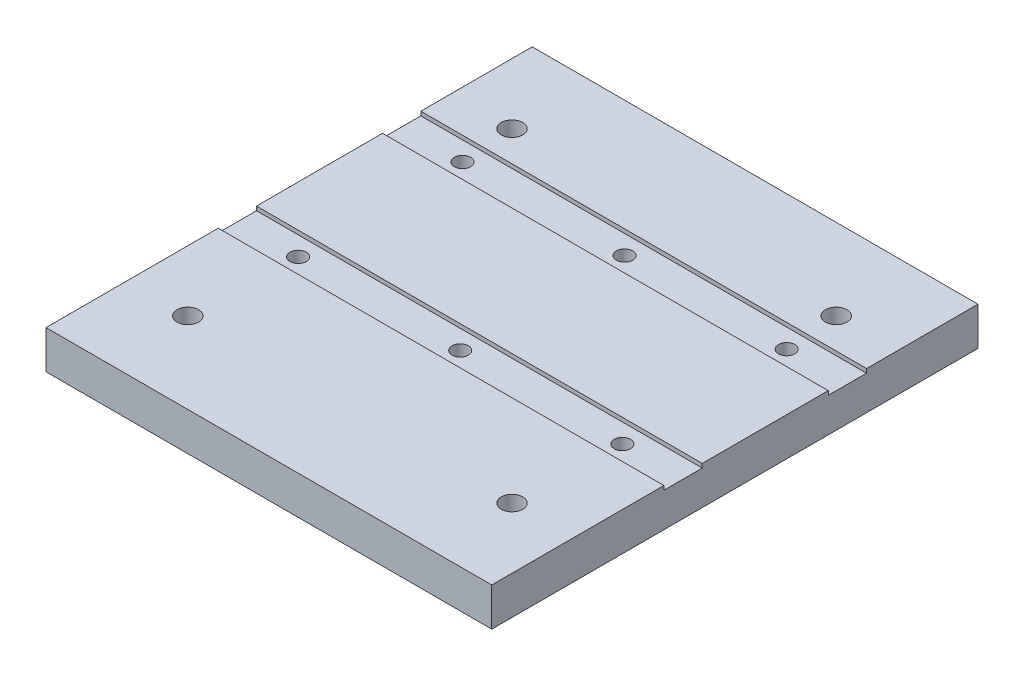
ISO-10303-21;
HEADER;
FILE_DESCRIPTION(('STEP AP214'),'2;1');
FILE_NAME('part.step','',(''),(''),'','','');
FILE_SCHEMA(('AUTOMOTIVE_DESIGN { 1 0 10303 214 1 1 1 1 }'));
ENDSEC;
DATA;
#1=APPLICATION_CONTEXT('core data for automotive mechanical design processes');
#2=APPLICATION_PROTOCOL_DEFINITION('international standard','automotive_design',2000,#1);
#3=PRODUCT_CONTEXT('',#1,'mechanical');
#4=PRODUCT('Part','Part','',(#3));
#5=PRODUCT_RELATED_PRODUCT_CATEGORY('part','',(#4));
#6=PRODUCT_DEFINITION_FORMATION('','',#4);
#7=PRODUCT_DEFINITION_CONTEXT('part definition',#1,'design');
#8=PRODUCT_DEFINITION('design','',#6,#7);
#9=PRODUCT_DEFINITION_SHAPE('','',#8);
#10=(LENGTH_UNIT() NAMED_UNIT(*) SI_UNIT(.MILLI.,.METRE.));
#11=(NAMED_UNIT(*) PLANE_ANGLE_UNIT() SI_UNIT($,.RADIAN.));
#12=(NAMED_UNIT(*) SI_UNIT($,.STERADIAN.) SOLID_ANGLE_UNIT());
#13=UNCERTAINTY_MEASURE_WITH_UNIT(LENGTH_MEASURE(1.E-05),#10,'distance_accuracy_value','');
#14=(GEOMETRIC_REPRESENTATION_CONTEXT(3) GLOBAL_UNCERTAINTY_ASSIGNED_CONTEXT((#13)) GLOBAL_UNIT_ASSIGNED_CONTEXT((#10,
#11,#12)) REPRESENTATION_CONTEXT('',''));
#15=CARTESIAN_POINT('',(0.,0.,0.));
#16=DIRECTION('',(0.,0.,1.));
#17=DIRECTION('',(1.,0.,0.));
#18=AXIS2_PLACEMENT_3D('',#15,#16,#17);
#19=CARTESIAN_POINT('',(0.,12.,0.));
#20=DIRECTION('',(0.,-1.,0.));
#21=DIRECTION('',(0.,0.,-1.));
#22=AXIS2_PLACEMENT_3D('',#19,#20,#21);
#23=PLANE('',#22);
#24=CARTESIAN_POINT('',(-50.8,12.,-50.8));
#25=DIRECTION('',(0.,1.,0.));
#26=DIRECTION('',(0.,0.,1.));
#27=AXIS2_PLACEMENT_3D('',#24,#25,#26);
#28=CIRCLE('',#27,3.3782);
#29=CARTESIAN_POINT('',(-50.8,12.,-47.4218));
#30=VERTEX_POINT('',#29);
#31=EDGE_CURVE('E185',#30,#30,#28,.T.);
#32=ORIENTED_EDGE('',*,*,#31,.F.);
#33=EDGE_LOOP('',(#32));
#34=FACE_BOUND('',#33,.T.);
#35=CARTESIAN_POINT('',(50.8,12.,-50.8));
#36=DIRECTION('',(0.,1.,0.));
#37=DIRECTION('',(0.,0.,1.));
#38=AXIS2_PLACEMENT_3D('',#35,#36,#37);
#39=CIRCLE('',#38,3.3782);
#40=CARTESIAN_POINT('',(50.8,12.,-47.4218));
#41=VERTEX_POINT('',#40);
#42=EDGE_CURVE('E192',#41,#41,#39,.T.);
#43=ORIENTED_EDGE('',*,*,#42,.F.);
#44=EDGE_LOOP('',(#43));
#45=FACE_BOUND('',#44,.T.);
#46=DIRECTION('',(0.,0.,1.));
#47=VECTOR('',#46,1.);
#48=CARTESIAN_POINT('',(-69.85,12.,76.2));
#49=LINE('',#48,#47);
#50=CARTESIAN_POINT('',(-69.85,12.,-76.2));
#51=VERTEX_POINT('',#50);
#52=CARTESIAN_POINT('',(-69.85,12.,-41.275));
#53=VERTEX_POINT('',#52);
#54=EDGE_CURVE('E219',#51,#53,#49,.T.);
#55=ORIENTED_EDGE('',*,*,#54,.T.);
#56=DIRECTION('',(-1.,0.,0.));
#57=VECTOR('',#56,1.);
#58=CARTESIAN_POINT('',(-69.85,12.,-41.275));
#59=LINE('',#58,#57);
#60=CARTESIAN_POINT('',(69.85,12.,-41.275));
#61=VERTEX_POINT('',#60);
#62=EDGE_CURVE('E147',#61,#53,#59,.T.);
#63=ORIENTED_EDGE('',*,*,#62,.F.);
#64=DIRECTION('',(0.,0.,-1.));
#65=VECTOR('',#64,1.);
#66=CARTESIAN_POINT('',(69.85,12.,76.2));
#67=LINE('',#66,#65);
#68=CARTESIAN_POINT('',(69.85,12.,-76.2));
#69=VERTEX_POINT('',#68);
#70=EDGE_CURVE('E216',#61,#69,#67,.T.);
#71=ORIENTED_EDGE('',*,*,#70,.T.);
#72=DIRECTION('',(-1.,0.,0.));
#73=VECTOR('',#72,1.);
#74=CARTESIAN_POINT('',(-69.85,12.,-76.2));
#75=LINE('',#74,#73);
#76=EDGE_CURVE('E214',#69,#51,#75,.T.);
#77=ORIENTED_EDGE('',*,*,#76,.T.);
#78=EDGE_LOOP('',(#55,#63,#71,#77));
#79=FACE_BOUND('',#78,.T.);
#80=ADVANCED_FACE('F41',(#34,#45,#79),#23,.F.);
#81=CARTESIAN_POINT('',(69.85,12.,10.225));
#82=VERTEX_POINT('',#81);
#83=CARTESIAN_POINT('',(69.85,12.,-29.275));
#84=VERTEX_POINT('',#83);
#85=EDGE_CURVE('E215',#82,#84,#67,.T.);
#86=ORIENTED_EDGE('',*,*,#85,.T.);
#87=DIRECTION('',(1.,0.,0.));
#88=VECTOR('',#87,1.);
#89=CARTESIAN_POINT('',(-69.85,12.,-29.275));
#90=LINE('',#89,#88);
#91=CARTESIAN_POINT('',(-69.85,12.,-29.275));
#92=VERTEX_POINT('',#91);
#93=EDGE_CURVE('E175',#92,#84,#90,.T.);
#94=ORIENTED_EDGE('',*,*,#93,.F.);
#95=CARTESIAN_POINT('',(-69.85,12.,10.225));
#96=VERTEX_POINT('',#95);
#97=EDGE_CURVE('E153',#92,#96,#49,.T.);
#98=ORIENTED_EDGE('',*,*,#97,.T.);
#99=DIRECTION('',(-1.,0.,0.));
#100=VECTOR('',#99,1.);
#101=CARTESIAN_POINT('',(-69.85,12.,10.225));
#102=LINE('',#101,#100);
#103=EDGE_CURVE('E170',#82,#96,#102,.T.);
#104=ORIENTED_EDGE('',*,*,#103,.F.);
#105=EDGE_LOOP('',(#86,#94,#98,#104));
#106=FACE_BOUND('',#105,.T.);
#107=ADVANCED_FACE('F318',(#106),#23,.F.);
#108=CARTESIAN_POINT('',(69.85,12.,76.2));
#109=DIRECTION('',(-1.,0.,0.));
#110=DIRECTION('',(0.,0.,1.));
#111=AXIS2_PLACEMENT_3D('',#108,#109,#110);
#112=PLANE('',#111);
#113=ORIENTED_EDGE('',*,*,#70,.F.);
#114=DIRECTION('',(0.,1.,0.));
#115=VECTOR('',#114,1.);
#116=CARTESIAN_POINT('',(69.85,10.73,-41.275));
#117=LINE('',#116,#115);
#118=CARTESIAN_POINT('',(69.85,10.73,-41.275));
#119=VERTEX_POINT('',#118);
#120=EDGE_CURVE('E155',#119,#61,#117,.T.);
#121=ORIENTED_EDGE('',*,*,#120,.F.);
#122=DIRECTION('',(0.,0.,-1.));
#123=VECTOR('',#122,1.);
#124=CARTESIAN_POINT('',(69.85,10.73,-41.275));
#125=LINE('',#124,#123);
#126=CARTESIAN_POINT('',(69.85,10.73,-29.275));
#127=VERTEX_POINT('',#126);
#128=EDGE_CURVE('E137',#127,#119,#125,.T.);
#129=ORIENTED_EDGE('',*,*,#128,.F.);
#130=DIRECTION('',(0.,1.,0.));
#131=VECTOR('',#130,1.);
#132=CARTESIAN_POINT('',(69.85,10.73,-29.275));
#133=LINE('',#132,#131);
#134=EDGE_CURVE('E134',#127,#84,#133,.T.);
#135=ORIENTED_EDGE('',*,*,#134,.T.);
#136=ORIENTED_EDGE('',*,*,#85,.F.);
#137=DIRECTION('',(0.,1.,0.));
#138=VECTOR('',#137,1.);
#139=CARTESIAN_POINT('',(69.85,10.73,10.225));
#140=LINE('',#139,#138);
#141=CARTESIAN_POINT('',(69.85,10.73,10.225));
#142=VERTEX_POINT('',#141);
#143=EDGE_CURVE('E165',#142,#82,#140,.T.);
#144=ORIENTED_EDGE('',*,*,#143,.F.);
#145=DIRECTION('',(0.,0.,-1.));
#146=VECTOR('',#145,1.);
#147=CARTESIAN_POINT('',(69.85,10.73,10.225));
#148=LINE('',#147,#146);
#149=CARTESIAN_POINT('',(69.85,10.73,22.225));
#150=VERTEX_POINT('',#149);
#151=EDGE_CURVE('E178',#150,#142,#148,.T.);
#152=ORIENTED_EDGE('',*,*,#151,.F.);
#153=DIRECTION('',(0.,1.,0.));
#154=VECTOR('',#153,1.);
#155=CARTESIAN_POINT('',(69.85,10.73,22.225));
#156=LINE('',#155,#154);
#157=CARTESIAN_POINT('',(69.85,12.,22.225));
#158=VERTEX_POINT('',#157);
#159=EDGE_CURVE('E162',#150,#158,#156,.T.);
#160=ORIENTED_EDGE('',*,*,#159,.T.);
#161=CARTESIAN_POINT('',(69.85,12.,76.2));
#162=VERTEX_POINT('',#161);
#163=EDGE_CURVE('E211',#162,#158,#67,.T.);
#164=ORIENTED_EDGE('',*,*,#163,.F.);
#165=DIRECTION('',(0.,-1.,0.));
#166=VECTOR('',#165,1.);
#167=CARTESIAN_POINT('',(69.85,12.,76.2));
#168=LINE('',#167,#166);
#169=CARTESIAN_POINT('',(69.85,0.,76.2));
#170=VERTEX_POINT('',#169);
#171=EDGE_CURVE('E224',#162,#170,#168,.T.);
#172=ORIENTED_EDGE('',*,*,#171,.T.);
#173=DIRECTION('',(0.,0.,-1.));
#174=VECTOR('',#173,1.);
#175=CARTESIAN_POINT('',(69.85,0.,76.2));
#176=LINE('',#175,#174);
#177=CARTESIAN_POINT('',(69.85,0.,-76.2));
#178=VERTEX_POINT('',#177);
#179=EDGE_CURVE('E210',#170,#178,#176,.T.);
#180=ORIENTED_EDGE('',*,*,#179,.T.);
#181=DIRECTION('',(0.,-1.,0.));
#182=VECTOR('',#181,1.);
#183=CARTESIAN_POINT('',(69.85,12.,-76.2));
#184=LINE('',#183,#182);
#185=EDGE_CURVE('E11',#69,#178,#184,.T.);
#186=ORIENTED_EDGE('',*,*,#185,.F.);
#187=EDGE_LOOP('',(#113,#121,#129,#135,#136,#144,#152,#160,#164,#172,#180,#186));
#188=FACE_BOUND('',#187,.T.);
#189=ADVANCED_FACE('F43',(#188),#112,.F.);
#190=CARTESIAN_POINT('',(-69.85,12.,-76.2));
#191=DIRECTION('',(0.,0.,1.));
#192=DIRECTION('',(1.,0.,0.));
#193=AXIS2_PLACEMENT_3D('',#190,#191,#192);
#194=PLANE('',#193);
#195=DIRECTION('',(-1.,0.,0.));
#196=VECTOR('',#195,1.);
#197=CARTESIAN_POINT('',(-69.85,0.,-76.2));
#198=LINE('',#197,#196);
#199=CARTESIAN_POINT('',(-69.85,0.,-76.2));
#200=VERTEX_POINT('',#199);
#201=EDGE_CURVE('E227',#178,#200,#198,.T.);
#202=ORIENTED_EDGE('',*,*,#201,.T.);
#203=DIRECTION('',(0.,-1.,0.));
#204=VECTOR('',#203,1.);
#205=CARTESIAN_POINT('',(-69.85,12.,-76.2));
#206=LINE('',#205,#204);
#207=EDGE_CURVE('E50',#51,#200,#206,.T.);
#208=ORIENTED_EDGE('',*,*,#207,.F.);
#209=ORIENTED_EDGE('',*,*,#76,.F.);
#210=ORIENTED_EDGE('',*,*,#185,.T.);
#211=EDGE_LOOP('',(#202,#208,#209,#210));
#212=FACE_BOUND('',#211,.T.);
#213=ADVANCED_FACE('F343',(#212),#194,.F.);
#214=CARTESIAN_POINT('',(-69.85,12.,76.2));
#215=DIRECTION('',(1.,0.,0.));
#216=DIRECTION('',(0.,0.,-1.));
#217=AXIS2_PLACEMENT_3D('',#214,#215,#216);
#218=PLANE('',#217);
#219=DIRECTION('',(0.,0.,1.));
#220=VECTOR('',#219,1.);
#221=CARTESIAN_POINT('',(-69.85,10.73,-41.275));
#222=LINE('',#221,#220);
#223=CARTESIAN_POINT('',(-69.85,10.73,-41.275));
#224=VERTEX_POINT('',#223);
#225=CARTESIAN_POINT('',(-69.85,10.73,-29.275));
#226=VERTEX_POINT('',#225);
#227=EDGE_CURVE('E138',#224,#226,#222,.T.);
#228=ORIENTED_EDGE('',*,*,#227,.F.);
#229=DIRECTION('',(0.,1.,0.));
#230=VECTOR('',#229,1.);
#231=CARTESIAN_POINT('',(-69.85,10.73,-41.275));
#232=LINE('',#231,#230);
#233=EDGE_CURVE('E189',#224,#53,#232,.T.);
#234=ORIENTED_EDGE('',*,*,#233,.T.);
#235=ORIENTED_EDGE('',*,*,#54,.F.);
#236=ORIENTED_EDGE('',*,*,#207,.T.);
#237=DIRECTION('',(0.,0.,1.));
#238=VECTOR('',#237,1.);
#239=CARTESIAN_POINT('',(-69.85,0.,76.2));
#240=LINE('',#239,#238);
#241=CARTESIAN_POINT('',(-69.85,0.,76.2));
#242=VERTEX_POINT('',#241);
#243=EDGE_CURVE('E229',#200,#242,#240,.T.);
#244=ORIENTED_EDGE('',*,*,#243,.T.);
#245=DIRECTION('',(0.,-1.,0.));
#246=VECTOR('',#245,1.);
#247=CARTESIAN_POINT('',(-69.85,12.,76.2));
#248=LINE('',#247,#246);
#249=CARTESIAN_POINT('',(-69.85,12.,76.2));
#250=VERTEX_POINT('',#249);
#251=EDGE_CURVE('E235',#250,#242,#248,.T.);
#252=ORIENTED_EDGE('',*,*,#251,.F.);
#253=CARTESIAN_POINT('',(-69.85,12.,22.225));
#254=VERTEX_POINT('',#253);
#255=EDGE_CURVE('E218',#254,#250,#49,.T.);
#256=ORIENTED_EDGE('',*,*,#255,.F.);
#257=DIRECTION('',(0.,1.,0.));
#258=VECTOR('',#257,1.);
#259=CARTESIAN_POINT('',(-69.85,10.73,22.225));
#260=LINE('',#259,#258);
#261=CARTESIAN_POINT('',(-69.85,10.73,22.225));
#262=VERTEX_POINT('',#261);
#263=EDGE_CURVE('E58',#262,#254,#260,.T.);
#264=ORIENTED_EDGE('',*,*,#263,.F.);
#265=DIRECTION('',(0.,0.,1.));
#266=VECTOR('',#265,1.);
#267=CARTESIAN_POINT('',(-69.85,10.73,10.225));
#268=LINE('',#267,#266);
#269=CARTESIAN_POINT('',(-69.85,10.73,10.225));
#270=VERTEX_POINT('',#269);
#271=EDGE_CURVE('E173',#270,#262,#268,.T.);
#272=ORIENTED_EDGE('',*,*,#271,.F.);
#273=DIRECTION('',(0.,1.,0.));
#274=VECTOR('',#273,1.);
#275=CARTESIAN_POINT('',(-69.85,10.73,10.225));
#276=LINE('',#275,#274);
#277=EDGE_CURVE('E167',#270,#96,#276,.T.);
#278=ORIENTED_EDGE('',*,*,#277,.T.);
#279=ORIENTED_EDGE('',*,*,#97,.F.);
#280=DIRECTION('',(0.,1.,0.));
#281=VECTOR('',#280,1.);
#282=CARTESIAN_POINT('',(-69.85,10.73,-29.275));
#283=LINE('',#282,#281);
#284=EDGE_CURVE('E66',#226,#92,#283,.T.);
#285=ORIENTED_EDGE('',*,*,#284,.F.);
#286=EDGE_LOOP('',(#228,#234,#235,#236,#244,#252,#256,#264,#272,#278,#279,#285));
#287=FACE_BOUND('',#286,.T.);
#288=ADVANCED_FACE('F150',(#287),#218,.F.);
#289=CARTESIAN_POINT('',(-69.85,12.,76.2));
#290=DIRECTION('',(0.,0.,-1.));
#291=DIRECTION('',(-1.,0.,0.));
#292=AXIS2_PLACEMENT_3D('',#289,#290,#291);
#293=PLANE('',#292);
#294=DIRECTION('',(1.,0.,0.));
#295=VECTOR('',#294,1.);
#296=CARTESIAN_POINT('',(-69.85,0.,76.2));
#297=LINE('',#296,#295);
#298=EDGE_CURVE('E231',#242,#170,#297,.T.);
#299=ORIENTED_EDGE('',*,*,#298,.T.);
#300=ORIENTED_EDGE('',*,*,#171,.F.);
#301=DIRECTION('',(1.,0.,0.));
#302=VECTOR('',#301,1.);
#303=CARTESIAN_POINT('',(-69.85,12.,76.2));
#304=LINE('',#303,#302);
#305=EDGE_CURVE('E222',#250,#162,#304,.T.);
#306=ORIENTED_EDGE('',*,*,#305,.F.);
#307=ORIENTED_EDGE('',*,*,#251,.T.);
#308=EDGE_LOOP('',(#299,#300,#306,#307));
#309=FACE_BOUND('',#308,.T.);
#310=ADVANCED_FACE('F344',(#309),#293,.F.);
#311=CARTESIAN_POINT('',(50.8,12.,50.8));
#312=DIRECTION('',(0.,1.,0.));
#313=DIRECTION('',(0.,0.,1.));
#314=AXIS2_PLACEMENT_3D('',#311,#312,#313);
#315=CIRCLE('',#314,3.3782);
#316=CARTESIAN_POINT('',(50.8,12.,54.1782));
#317=VERTEX_POINT('',#316);
#318=EDGE_CURVE('E198',#317,#317,#315,.T.);
#319=ORIENTED_EDGE('',*,*,#318,.F.);
#320=EDGE_LOOP('',(#319));
#321=FACE_BOUND('',#320,.T.);
#322=CARTESIAN_POINT('',(-50.8,12.,50.8));
#323=DIRECTION('',(0.,1.,0.));
#324=DIRECTION('',(0.,0.,1.));
#325=AXIS2_PLACEMENT_3D('',#322,#323,#324);
#326=CIRCLE('',#325,3.3782);
#327=CARTESIAN_POINT('',(-50.8,12.,54.1782));
#328=VERTEX_POINT('',#327);
#329=EDGE_CURVE('E204',#328,#328,#326,.T.);
#330=ORIENTED_EDGE('',*,*,#329,.F.);
#331=EDGE_LOOP('',(#330));
#332=FACE_BOUND('',#331,.T.);
#333=ORIENTED_EDGE('',*,*,#163,.T.);
#334=DIRECTION('',(1.,0.,0.));
#335=VECTOR('',#334,1.);
#336=CARTESIAN_POINT('',(-69.85,12.,22.225));
#337=LINE('',#336,#335);
#338=EDGE_CURVE('E172',#254,#158,#337,.T.);
#339=ORIENTED_EDGE('',*,*,#338,.F.);
#340=ORIENTED_EDGE('',*,*,#255,.T.);
#341=ORIENTED_EDGE('',*,*,#305,.T.);
#342=EDGE_LOOP('',(#333,#339,#340,#341));
#343=FACE_BOUND('',#342,.T.);
#344=ADVANCED_FACE('F331',(#321,#332,#343),#23,.F.);
#345=CARTESIAN_POINT('',(0.,0.,0.));
#346=DIRECTION('',(0.,-1.,0.));
#347=DIRECTION('',(0.,0.,-1.));
#348=AXIS2_PLACEMENT_3D('',#345,#346,#347);
#349=PLANE('',#348);
#350=CARTESIAN_POINT('',(50.8,0.,-35.275));
#351=DIRECTION('',(0.,-1.,0.));
#352=DIRECTION('',(0.,0.,-1.));
#353=AXIS2_PLACEMENT_3D('',#350,#351,#352);
#354=CIRCLE('',#353,4.7625);
#355=CARTESIAN_POINT('',(50.8,0.,-40.0375));
#356=VERTEX_POINT('',#355);
#357=EDGE_CURVE('E375',#356,#356,#354,.T.);
#358=ORIENTED_EDGE('',*,*,#357,.F.);
#359=EDGE_LOOP('',(#358));
#360=FACE_BOUND('',#359,.T.);
#361=CARTESIAN_POINT('',(0.,0.,-35.275));
#362=DIRECTION('',(0.,-1.,0.));
#363=DIRECTION('',(0.,0.,-1.));
#364=AXIS2_PLACEMENT_3D('',#361,#362,#363);
#365=CIRCLE('',#364,4.7625);
#366=CARTESIAN_POINT('',(0.,0.,-40.0375));
#367=VERTEX_POINT('',#366);
#368=EDGE_CURVE('E272',#367,#367,#365,.T.);
#369=ORIENTED_EDGE('',*,*,#368,.F.);
#370=EDGE_LOOP('',(#369));
#371=FACE_BOUND('',#370,.T.);
#372=CARTESIAN_POINT('',(-50.8,0.,-35.275));
#373=DIRECTION('',(0.,-1.,0.));
#374=DIRECTION('',(0.,0.,-1.));
#375=AXIS2_PLACEMENT_3D('',#372,#373,#374);
#376=CIRCLE('',#375,4.7625);
#377=CARTESIAN_POINT('',(-50.8,0.,-40.0375));
#378=VERTEX_POINT('',#377);
#379=EDGE_CURVE('E259',#378,#378,#376,.T.);
#380=ORIENTED_EDGE('',*,*,#379,.F.);
#381=EDGE_LOOP('',(#380));
#382=FACE_BOUND('',#381,.T.);
#383=CARTESIAN_POINT('',(-50.8,0.,16.225));
#384=DIRECTION('',(0.,-1.,0.));
#385=DIRECTION('',(0.,0.,-1.));
#386=AXIS2_PLACEMENT_3D('',#383,#384,#385);
#387=CIRCLE('',#386,4.7625);
#388=CARTESIAN_POINT('',(-50.8,0.,11.4625));
#389=VERTEX_POINT('',#388);
#390=EDGE_CURVE('E255',#389,#389,#387,.T.);
#391=ORIENTED_EDGE('',*,*,#390,.F.);
#392=EDGE_LOOP('',(#391));
#393=FACE_BOUND('',#392,.T.);
#394=CARTESIAN_POINT('',(0.,0.,16.225));
#395=DIRECTION('',(0.,-1.,0.));
#396=DIRECTION('',(0.,0.,-1.));
#397=AXIS2_PLACEMENT_3D('',#394,#395,#396);
#398=CIRCLE('',#397,4.7625);
#399=CARTESIAN_POINT('',(0.,0.,11.4625));
#400=VERTEX_POINT('',#399);
#401=EDGE_CURVE('E251',#400,#400,#398,.T.);
#402=ORIENTED_EDGE('',*,*,#401,.F.);
#403=EDGE_LOOP('',(#402));
#404=FACE_BOUND('',#403,.T.);
#405=CARTESIAN_POINT('',(50.8,0.,16.225));
#406=DIRECTION('',(0.,-1.,0.));
#407=DIRECTION('',(0.,0.,-1.));
#408=AXIS2_PLACEMENT_3D('',#405,#406,#407);
#409=CIRCLE('',#408,4.7625);
#410=CARTESIAN_POINT('',(50.8,0.,11.4625));
#411=VERTEX_POINT('',#410);
#412=EDGE_CURVE('E246',#411,#411,#409,.T.);
#413=ORIENTED_EDGE('',*,*,#412,.F.);
#414=EDGE_LOOP('',(#413));
#415=FACE_BOUND('',#414,.T.);
#416=CARTESIAN_POINT('',(-50.8,0.,-50.8));
#417=DIRECTION('',(0.,1.,0.));
#418=DIRECTION('',(0.,0.,1.));
#419=AXIS2_PLACEMENT_3D('',#416,#417,#418);
#420=CIRCLE('',#419,3.3782);
#421=CARTESIAN_POINT('',(-50.8,0.,-47.4218));
#422=VERTEX_POINT('',#421);
#423=EDGE_CURVE('E188',#422,#422,#420,.T.);
#424=ORIENTED_EDGE('',*,*,#423,.T.);
#425=EDGE_LOOP('',(#424));
#426=FACE_BOUND('',#425,.T.);
#427=CARTESIAN_POINT('',(50.8,0.,-50.8));
#428=DIRECTION('',(0.,1.,0.));
#429=DIRECTION('',(0.,0.,1.));
#430=AXIS2_PLACEMENT_3D('',#427,#428,#429);
#431=CIRCLE('',#430,3.3782);
#432=CARTESIAN_POINT('',(50.8,0.,-47.4218));
#433=VERTEX_POINT('',#432);
#434=EDGE_CURVE('E195',#433,#433,#431,.T.);
#435=ORIENTED_EDGE('',*,*,#434,.T.);
#436=EDGE_LOOP('',(#435));
#437=FACE_BOUND('',#436,.T.);
#438=CARTESIAN_POINT('',(50.8,0.,50.8));
#439=DIRECTION('',(0.,1.,0.));
#440=DIRECTION('',(0.,0.,1.));
#441=AXIS2_PLACEMENT_3D('',#438,#439,#440);
#442=CIRCLE('',#441,3.3782);
#443=CARTESIAN_POINT('',(50.8,0.,54.1782));
#444=VERTEX_POINT('',#443);
#445=EDGE_CURVE('E201',#444,#444,#442,.T.);
#446=ORIENTED_EDGE('',*,*,#445,.T.);
#447=EDGE_LOOP('',(#446));
#448=FACE_BOUND('',#447,.T.);
#449=CARTESIAN_POINT('',(-50.8,0.,50.8));
#450=DIRECTION('',(0.,1.,0.));
#451=DIRECTION('',(0.,0.,1.));
#452=AXIS2_PLACEMENT_3D('',#449,#450,#451);
#453=CIRCLE('',#452,3.3782);
#454=CARTESIAN_POINT('',(-50.8,0.,54.1782));
#455=VERTEX_POINT('',#454);
#456=EDGE_CURVE('E207',#455,#455,#453,.T.);
#457=ORIENTED_EDGE('',*,*,#456,.T.);
#458=EDGE_LOOP('',(#457));
#459=FACE_BOUND('',#458,.T.);
#460=ORIENTED_EDGE('',*,*,#179,.F.);
#461=ORIENTED_EDGE('',*,*,#298,.F.);
#462=ORIENTED_EDGE('',*,*,#243,.F.);
#463=ORIENTED_EDGE('',*,*,#201,.F.);
#464=EDGE_LOOP('',(#460,#461,#462,#463));
#465=FACE_BOUND('',#464,.T.);
#466=ADVANCED_FACE('F339',(#360,#371,#382,#393,#404,#415,#426,#437,#448,#459,#465),#349,.T.);
#467=CARTESIAN_POINT('',(-50.8,12.,50.8));
#468=DIRECTION('',(0.,1.,0.));
#469=DIRECTION('',(0.,0.,1.));
#470=AXIS2_PLACEMENT_3D('',#467,#468,#469);
#471=CYLINDRICAL_SURFACE('',#470,3.3782);
#472=ORIENTED_EDGE('',*,*,#456,.F.);
#473=EDGE_LOOP('',(#472));
#474=FACE_BOUND('',#473,.T.);
#475=ORIENTED_EDGE('',*,*,#329,.T.);
#476=EDGE_LOOP('',(#475));
#477=FACE_BOUND('',#476,.T.);
#478=ADVANCED_FACE('F363',(#474,#477),#471,.F.);
#479=CARTESIAN_POINT('',(50.8,12.,50.8));
#480=DIRECTION('',(0.,1.,0.));
#481=DIRECTION('',(0.,0.,1.));
#482=AXIS2_PLACEMENT_3D('',#479,#480,#481);
#483=CYLINDRICAL_SURFACE('',#482,3.3782);
#484=ORIENTED_EDGE('',*,*,#445,.F.);
#485=EDGE_LOOP('',(#484));
#486=FACE_BOUND('',#485,.T.);
#487=ORIENTED_EDGE('',*,*,#318,.T.);
#488=EDGE_LOOP('',(#487));
#489=FACE_BOUND('',#488,.T.);
#490=ADVANCED_FACE('F370',(#486,#489),#483,.F.);
#491=CARTESIAN_POINT('',(50.8,12.,-50.8));
#492=DIRECTION('',(0.,1.,0.));
#493=DIRECTION('',(0.,0.,1.));
#494=AXIS2_PLACEMENT_3D('',#491,#492,#493);
#495=CYLINDRICAL_SURFACE('',#494,3.3782);
#496=ORIENTED_EDGE('',*,*,#434,.F.);
#497=EDGE_LOOP('',(#496));
#498=FACE_BOUND('',#497,.T.);
#499=ORIENTED_EDGE('',*,*,#42,.T.);
#500=EDGE_LOOP('',(#499));
#501=FACE_BOUND('',#500,.T.);
#502=ADVANCED_FACE('F400',(#498,#501),#495,.F.);
#503=CARTESIAN_POINT('',(-50.8,12.,-50.8));
#504=DIRECTION('',(0.,1.,0.));
#505=DIRECTION('',(0.,0.,1.));
#506=AXIS2_PLACEMENT_3D('',#503,#504,#505);
#507=CYLINDRICAL_SURFACE('',#506,3.3782);
#508=ORIENTED_EDGE('',*,*,#423,.F.);
#509=EDGE_LOOP('',(#508));
#510=FACE_BOUND('',#509,.T.);
#511=ORIENTED_EDGE('',*,*,#31,.T.);
#512=EDGE_LOOP('',(#511));
#513=FACE_BOUND('',#512,.T.);
#514=ADVANCED_FACE('F405',(#510,#513),#507,.F.);
#515=CARTESIAN_POINT('',(-69.85,10.73,10.225));
#516=DIRECTION('',(0.,0.,-1.));
#517=DIRECTION('',(-1.,0.,0.));
#518=AXIS2_PLACEMENT_3D('',#515,#516,#517);
#519=PLANE('',#518);
#520=ORIENTED_EDGE('',*,*,#103,.T.);
#521=ORIENTED_EDGE('',*,*,#277,.F.);
#522=DIRECTION('',(-1.,0.,0.));
#523=VECTOR('',#522,1.);
#524=CARTESIAN_POINT('',(-69.85,10.73,10.225));
#525=LINE('',#524,#523);
#526=EDGE_CURVE('E161',#142,#270,#525,.T.);
#527=ORIENTED_EDGE('',*,*,#526,.F.);
#528=ORIENTED_EDGE('',*,*,#143,.T.);
#529=EDGE_LOOP('',(#520,#521,#527,#528));
#530=FACE_BOUND('',#529,.T.);
#531=ADVANCED_FACE('F323',(#530),#519,.F.);
#532=CARTESIAN_POINT('',(-69.85,10.73,22.225));
#533=DIRECTION('',(0.,0.,1.));
#534=DIRECTION('',(1.,0.,0.));
#535=AXIS2_PLACEMENT_3D('',#532,#533,#534);
#536=PLANE('',#535);
#537=ORIENTED_EDGE('',*,*,#338,.T.);
#538=ORIENTED_EDGE('',*,*,#159,.F.);
#539=DIRECTION('',(1.,0.,0.));
#540=VECTOR('',#539,1.);
#541=CARTESIAN_POINT('',(-69.85,10.73,22.225));
#542=LINE('',#541,#540);
#543=EDGE_CURVE('E180',#262,#150,#542,.T.);
#544=ORIENTED_EDGE('',*,*,#543,.F.);
#545=ORIENTED_EDGE('',*,*,#263,.T.);
#546=EDGE_LOOP('',(#537,#538,#544,#545));
#547=FACE_BOUND('',#546,.T.);
#548=ADVANCED_FACE('F334',(#547),#536,.F.);
#549=CARTESIAN_POINT('',(0.,10.73,0.));
#550=DIRECTION('',(0.,1.,0.));
#551=DIRECTION('',(0.,0.,1.));
#552=AXIS2_PLACEMENT_3D('',#549,#550,#551);
#553=PLANE('',#552);
#554=CARTESIAN_POINT('',(-50.8,10.73,16.225));
#555=DIRECTION('',(0.,1.,0.));
#556=DIRECTION('',(0.,0.,1.));
#557=AXIS2_PLACEMENT_3D('',#554,#555,#556);
#558=CIRCLE('',#557,2.5527);
#559=CARTESIAN_POINT('',(-50.8,10.73,18.7777));
#560=VERTEX_POINT('',#559);
#561=EDGE_CURVE('E248',#560,#560,#558,.T.);
#562=ORIENTED_EDGE('',*,*,#561,.F.);
#563=EDGE_LOOP('',(#562));
#564=FACE_BOUND('',#563,.T.);
#565=CARTESIAN_POINT('',(0.,10.73,16.225));
#566=DIRECTION('',(0.,1.,0.));
#567=DIRECTION('',(0.,0.,1.));
#568=AXIS2_PLACEMENT_3D('',#565,#566,#567);
#569=CIRCLE('',#568,2.5527);
#570=CARTESIAN_POINT('',(0.,10.73,18.7777));
#571=VERTEX_POINT('',#570);
#572=EDGE_CURVE('E243',#571,#571,#569,.T.);
#573=ORIENTED_EDGE('',*,*,#572,.F.);
#574=EDGE_LOOP('',(#573));
#575=FACE_BOUND('',#574,.T.);
#576=CARTESIAN_POINT('',(50.8,10.73,16.225));
#577=DIRECTION('',(0.,1.,0.));
#578=DIRECTION('',(0.,0.,1.));
#579=AXIS2_PLACEMENT_3D('',#576,#577,#578);
#580=CIRCLE('',#579,2.5527);
#581=CARTESIAN_POINT('',(50.8,10.73,18.7777));
#582=VERTEX_POINT('',#581);
#583=EDGE_CURVE('E169',#582,#582,#580,.T.);
#584=ORIENTED_EDGE('',*,*,#583,.F.);
#585=EDGE_LOOP('',(#584));
#586=FACE_BOUND('',#585,.T.);
#587=ORIENTED_EDGE('',*,*,#271,.T.);
#588=ORIENTED_EDGE('',*,*,#543,.T.);
#589=ORIENTED_EDGE('',*,*,#151,.T.);
#590=ORIENTED_EDGE('',*,*,#526,.T.);
#591=EDGE_LOOP('',(#587,#588,#589,#590));
#592=FACE_BOUND('',#591,.T.);
#593=ADVANCED_FACE('F326',(#564,#575,#586,#592),#553,.T.);
#594=CARTESIAN_POINT('',(-69.85,10.73,-41.275));
#595=DIRECTION('',(0.,0.,-1.));
#596=DIRECTION('',(-1.,0.,0.));
#597=AXIS2_PLACEMENT_3D('',#594,#595,#596);
#598=PLANE('',#597);
#599=ORIENTED_EDGE('',*,*,#62,.T.);
#600=ORIENTED_EDGE('',*,*,#233,.F.);
#601=DIRECTION('',(-1.,0.,0.));
#602=VECTOR('',#601,1.);
#603=CARTESIAN_POINT('',(-69.85,10.73,-41.275));
#604=LINE('',#603,#602);
#605=EDGE_CURVE('E144',#119,#224,#604,.T.);
#606=ORIENTED_EDGE('',*,*,#605,.F.);
#607=ORIENTED_EDGE('',*,*,#120,.T.);
#608=EDGE_LOOP('',(#599,#600,#606,#607));
#609=FACE_BOUND('',#608,.T.);
#610=ADVANCED_FACE('F307',(#609),#598,.F.);
#611=CARTESIAN_POINT('',(-69.85,10.73,-29.275));
#612=DIRECTION('',(0.,0.,1.));
#613=DIRECTION('',(1.,0.,0.));
#614=AXIS2_PLACEMENT_3D('',#611,#612,#613);
#615=PLANE('',#614);
#616=ORIENTED_EDGE('',*,*,#93,.T.);
#617=ORIENTED_EDGE('',*,*,#134,.F.);
#618=DIRECTION('',(1.,0.,0.));
#619=VECTOR('',#618,1.);
#620=CARTESIAN_POINT('',(-69.85,10.73,-29.275));
#621=LINE('',#620,#619);
#622=EDGE_CURVE('E130',#226,#127,#621,.T.);
#623=ORIENTED_EDGE('',*,*,#622,.F.);
#624=ORIENTED_EDGE('',*,*,#284,.T.);
#625=EDGE_LOOP('',(#616,#617,#623,#624));
#626=FACE_BOUND('',#625,.T.);
#627=ADVANCED_FACE('F132',(#626),#615,.F.);
#628=CARTESIAN_POINT('',(0.,10.73,0.));
#629=DIRECTION('',(0.,1.,0.));
#630=DIRECTION('',(0.,0.,1.));
#631=AXIS2_PLACEMENT_3D('',#628,#629,#630);
#632=PLANE('',#631);
#633=CARTESIAN_POINT('',(50.8,10.73,-35.275));
#634=DIRECTION('',(0.,1.,0.));
#635=DIRECTION('',(0.,0.,1.));
#636=AXIS2_PLACEMENT_3D('',#633,#634,#635);
#637=CIRCLE('',#636,2.5527);
#638=CARTESIAN_POINT('',(50.8,10.73,-32.7223));
#639=VERTEX_POINT('',#638);
#640=EDGE_CURVE('E45',#639,#639,#637,.T.);
#641=ORIENTED_EDGE('',*,*,#640,.F.);
#642=EDGE_LOOP('',(#641));
#643=FACE_BOUND('',#642,.T.);
#644=CARTESIAN_POINT('',(0.,10.73,-35.275));
#645=DIRECTION('',(0.,1.,0.));
#646=DIRECTION('',(0.,0.,1.));
#647=AXIS2_PLACEMENT_3D('',#644,#645,#646);
#648=CIRCLE('',#647,2.5527);
#649=CARTESIAN_POINT('',(0.,10.73,-32.7223));
#650=VERTEX_POINT('',#649);
#651=EDGE_CURVE('E257',#650,#650,#648,.T.);
#652=ORIENTED_EDGE('',*,*,#651,.F.);
#653=EDGE_LOOP('',(#652));
#654=FACE_BOUND('',#653,.T.);
#655=CARTESIAN_POINT('',(-50.8,10.73,-35.275));
#656=DIRECTION('',(0.,1.,0.));
#657=DIRECTION('',(0.,0.,1.));
#658=AXIS2_PLACEMENT_3D('',#655,#656,#657);
#659=CIRCLE('',#658,2.5527);
#660=CARTESIAN_POINT('',(-50.8,10.73,-32.7223));
#661=VERTEX_POINT('',#660);
#662=EDGE_CURVE('E253',#661,#661,#659,.T.);
#663=ORIENTED_EDGE('',*,*,#662,.F.);
#664=EDGE_LOOP('',(#663));
#665=FACE_BOUND('',#664,.T.);
#666=ORIENTED_EDGE('',*,*,#227,.T.);
#667=ORIENTED_EDGE('',*,*,#622,.T.);
#668=ORIENTED_EDGE('',*,*,#128,.T.);
#669=ORIENTED_EDGE('',*,*,#605,.T.);
#670=EDGE_LOOP('',(#666,#667,#668,#669));
#671=FACE_BOUND('',#670,.T.);
#672=ADVANCED_FACE('F142',(#643,#654,#665,#671),#632,.T.);
#673=CARTESIAN_POINT('',(50.8,0.,16.225));
#674=DIRECTION('',(0.,-1.,0.));
#675=DIRECTION('',(0.,0.,-1.));
#676=AXIS2_PLACEMENT_3D('',#673,#674,#675);
#677=CYLINDRICAL_SURFACE('',#676,2.5527);
#678=ORIENTED_EDGE('',*,*,#583,.T.);
#679=EDGE_LOOP('',(#678));
#680=FACE_BOUND('',#679,.T.);
#681=CARTESIAN_POINT('',(50.8,4.826,16.225));
#682=DIRECTION('',(0.,-1.,0.));
#683=DIRECTION('',(0.,0.,-1.));
#684=AXIS2_PLACEMENT_3D('',#681,#682,#683);
#685=CIRCLE('',#684,2.55270000000001);
#686=CARTESIAN_POINT('',(50.8,4.826,13.6723));
#687=VERTEX_POINT('',#686);
#688=EDGE_CURVE('E242',#687,#687,#685,.T.);
#689=ORIENTED_EDGE('',*,*,#688,.T.);
#690=EDGE_LOOP('',(#689));
#691=FACE_BOUND('',#690,.T.);
#692=ADVANCED_FACE('F425',(#680,#691),#677,.F.);
#693=CARTESIAN_POINT('',(53.3527,4.826,16.225));
#694=DIRECTION('',(0.,1.,0.));
#695=DIRECTION('',(0.,0.,1.));
#696=AXIS2_PLACEMENT_3D('',#693,#694,#695);
#697=PLANE('',#696);
#698=ORIENTED_EDGE('',*,*,#688,.F.);
#699=EDGE_LOOP('',(#698));
#700=FACE_BOUND('',#699,.T.);
#701=CARTESIAN_POINT('',(50.8,4.826,16.225));
#702=DIRECTION('',(0.,-1.,0.));
#703=DIRECTION('',(0.,0.,-1.));
#704=AXIS2_PLACEMENT_3D('',#701,#702,#703);
#705=CIRCLE('',#704,4.7625);
#706=CARTESIAN_POINT('',(50.8,4.826,11.4625));
#707=VERTEX_POINT('',#706);
#708=EDGE_CURVE('E296',#707,#707,#705,.T.);
#709=ORIENTED_EDGE('',*,*,#708,.T.);
#710=EDGE_LOOP('',(#709));
#711=FACE_BOUND('',#710,.T.);
#712=ADVANCED_FACE('F429',(#700,#711),#697,.F.);
#713=CARTESIAN_POINT('',(50.8,0.,16.225));
#714=DIRECTION('',(0.,-1.,0.));
#715=DIRECTION('',(0.,0.,-1.));
#716=AXIS2_PLACEMENT_3D('',#713,#714,#715);
#717=CYLINDRICAL_SURFACE('',#716,4.7625);
#718=ORIENTED_EDGE('',*,*,#708,.F.);
#719=EDGE_LOOP('',(#718));
#720=FACE_BOUND('',#719,.T.);
#721=ORIENTED_EDGE('',*,*,#412,.T.);
#722=EDGE_LOOP('',(#721));
#723=FACE_BOUND('',#722,.T.);
#724=ADVANCED_FACE('F433',(#720,#723),#717,.F.);
#725=CARTESIAN_POINT('',(0.,0.,16.225));
#726=DIRECTION('',(0.,-1.,0.));
#727=DIRECTION('',(0.,0.,-1.));
#728=AXIS2_PLACEMENT_3D('',#725,#726,#727);
#729=CYLINDRICAL_SURFACE('',#728,2.5527);
#730=ORIENTED_EDGE('',*,*,#572,.T.);
#731=EDGE_LOOP('',(#730));
#732=FACE_BOUND('',#731,.T.);
#733=CARTESIAN_POINT('',(0.,4.826,16.225));
#734=DIRECTION('',(0.,-1.,0.));
#735=DIRECTION('',(0.,0.,-1.));
#736=AXIS2_PLACEMENT_3D('',#733,#734,#735);
#737=CIRCLE('',#736,2.5527);
#738=CARTESIAN_POINT('',(0.,4.826,13.6723));
#739=VERTEX_POINT('',#738);
#740=EDGE_CURVE('E247',#739,#739,#737,.T.);
#741=ORIENTED_EDGE('',*,*,#740,.T.);
#742=EDGE_LOOP('',(#741));
#743=FACE_BOUND('',#742,.T.);
#744=ADVANCED_FACE('F437',(#732,#743),#729,.F.);
#745=CARTESIAN_POINT('',(2.5527,4.826,16.225));
#746=DIRECTION('',(0.,1.,0.));
#747=DIRECTION('',(0.,0.,1.));
#748=AXIS2_PLACEMENT_3D('',#745,#746,#747);
#749=PLANE('',#748);
#750=ORIENTED_EDGE('',*,*,#740,.F.);
#751=EDGE_LOOP('',(#750));
#752=FACE_BOUND('',#751,.T.);
#753=CARTESIAN_POINT('',(0.,4.826,16.225));
#754=DIRECTION('',(0.,-1.,0.));
#755=DIRECTION('',(0.,0.,-1.));
#756=AXIS2_PLACEMENT_3D('',#753,#754,#755);
#757=CIRCLE('',#756,4.7625);
#758=CARTESIAN_POINT('',(0.,4.826,11.4625));
#759=VERTEX_POINT('',#758);
#760=EDGE_CURVE('E289',#759,#759,#757,.T.);
#761=ORIENTED_EDGE('',*,*,#760,.T.);
#762=EDGE_LOOP('',(#761));
#763=FACE_BOUND('',#762,.T.);
#764=ADVANCED_FACE('F441',(#752,#763),#749,.F.);
#765=CARTESIAN_POINT('',(0.,0.,16.225));
#766=DIRECTION('',(0.,-1.,0.));
#767=DIRECTION('',(0.,0.,-1.));
#768=AXIS2_PLACEMENT_3D('',#765,#766,#767);
#769=CYLINDRICAL_SURFACE('',#768,4.7625);
#770=ORIENTED_EDGE('',*,*,#760,.F.);
#771=EDGE_LOOP('',(#770));
#772=FACE_BOUND('',#771,.T.);
#773=ORIENTED_EDGE('',*,*,#401,.T.);
#774=EDGE_LOOP('',(#773));
#775=FACE_BOUND('',#774,.T.);
#776=ADVANCED_FACE('F445',(#772,#775),#769,.F.);
#777=CARTESIAN_POINT('',(-50.8,0.,16.225));
#778=DIRECTION('',(0.,-1.,0.));
#779=DIRECTION('',(0.,0.,-1.));
#780=AXIS2_PLACEMENT_3D('',#777,#778,#779);
#781=CYLINDRICAL_SURFACE('',#780,2.5527);
#782=ORIENTED_EDGE('',*,*,#561,.T.);
#783=EDGE_LOOP('',(#782));
#784=FACE_BOUND('',#783,.T.);
#785=CARTESIAN_POINT('',(-50.8,4.826,16.225));
#786=DIRECTION('',(0.,-1.,0.));
#787=DIRECTION('',(0.,0.,-1.));
#788=AXIS2_PLACEMENT_3D('',#785,#786,#787);
#789=CIRCLE('',#788,2.55270000000001);
#790=CARTESIAN_POINT('',(-50.8,4.826,13.6723));
#791=VERTEX_POINT('',#790);
#792=EDGE_CURVE('E252',#791,#791,#789,.T.);
#793=ORIENTED_EDGE('',*,*,#792,.T.);
#794=EDGE_LOOP('',(#793));
#795=FACE_BOUND('',#794,.T.);
#796=ADVANCED_FACE('F449',(#784,#795),#781,.F.);
#797=CARTESIAN_POINT('',(-48.2473,4.826,16.225));
#798=DIRECTION('',(0.,1.,0.));
#799=DIRECTION('',(0.,0.,1.));
#800=AXIS2_PLACEMENT_3D('',#797,#798,#799);
#801=PLANE('',#800);
#802=ORIENTED_EDGE('',*,*,#792,.F.);
#803=EDGE_LOOP('',(#802));
#804=FACE_BOUND('',#803,.T.);
#805=CARTESIAN_POINT('',(-50.8,4.826,16.225));
#806=DIRECTION('',(0.,-1.,0.));
#807=DIRECTION('',(0.,0.,-1.));
#808=AXIS2_PLACEMENT_3D('',#805,#806,#807);
#809=CIRCLE('',#808,4.7625);
#810=CARTESIAN_POINT('',(-50.8,4.826,11.4625));
#811=VERTEX_POINT('',#810);
#812=EDGE_CURVE('E282',#811,#811,#809,.T.);
#813=ORIENTED_EDGE('',*,*,#812,.T.);
#814=EDGE_LOOP('',(#813));
#815=FACE_BOUND('',#814,.T.);
#816=ADVANCED_FACE('F453',(#804,#815),#801,.F.);
#817=CARTESIAN_POINT('',(-50.8,0.,16.225));
#818=DIRECTION('',(0.,-1.,0.));
#819=DIRECTION('',(0.,0.,-1.));
#820=AXIS2_PLACEMENT_3D('',#817,#818,#819);
#821=CYLINDRICAL_SURFACE('',#820,4.7625);
#822=ORIENTED_EDGE('',*,*,#812,.F.);
#823=EDGE_LOOP('',(#822));
#824=FACE_BOUND('',#823,.T.);
#825=ORIENTED_EDGE('',*,*,#390,.T.);
#826=EDGE_LOOP('',(#825));
#827=FACE_BOUND('',#826,.T.);
#828=ADVANCED_FACE('F457',(#824,#827),#821,.F.);
#829=CARTESIAN_POINT('',(-50.8,0.,-35.275));
#830=DIRECTION('',(0.,-1.,0.));
#831=DIRECTION('',(0.,0.,-1.));
#832=AXIS2_PLACEMENT_3D('',#829,#830,#831);
#833=CYLINDRICAL_SURFACE('',#832,2.5527);
#834=ORIENTED_EDGE('',*,*,#662,.T.);
#835=EDGE_LOOP('',(#834));
#836=FACE_BOUND('',#835,.T.);
#837=CARTESIAN_POINT('',(-50.8,4.826,-35.275));
#838=DIRECTION('',(0.,-1.,0.));
#839=DIRECTION('',(0.,0.,-1.));
#840=AXIS2_PLACEMENT_3D('',#837,#838,#839);
#841=CIRCLE('',#840,2.55270000000001);
#842=CARTESIAN_POINT('',(-50.8,4.826,-37.8277));
#843=VERTEX_POINT('',#842);
#844=EDGE_CURVE('E256',#843,#843,#841,.T.);
#845=ORIENTED_EDGE('',*,*,#844,.T.);
#846=EDGE_LOOP('',(#845));
#847=FACE_BOUND('',#846,.T.);
#848=ADVANCED_FACE('F461',(#836,#847),#833,.F.);
#849=CARTESIAN_POINT('',(-48.2473,4.826,-35.275));
#850=DIRECTION('',(0.,1.,0.));
#851=DIRECTION('',(0.,0.,1.));
#852=AXIS2_PLACEMENT_3D('',#849,#850,#851);
#853=PLANE('',#852);
#854=ORIENTED_EDGE('',*,*,#844,.F.);
#855=EDGE_LOOP('',(#854));
#856=FACE_BOUND('',#855,.T.);
#857=CARTESIAN_POINT('',(-50.8,4.826,-35.275));
#858=DIRECTION('',(0.,-1.,0.));
#859=DIRECTION('',(0.,0.,-1.));
#860=AXIS2_PLACEMENT_3D('',#857,#858,#859);
#861=CIRCLE('',#860,4.7625);
#862=CARTESIAN_POINT('',(-50.8,4.826,-40.0375));
#863=VERTEX_POINT('',#862);
#864=EDGE_CURVE('E264',#863,#863,#861,.T.);
#865=ORIENTED_EDGE('',*,*,#864,.T.);
#866=EDGE_LOOP('',(#865));
#867=FACE_BOUND('',#866,.T.);
#868=ADVANCED_FACE('F465',(#856,#867),#853,.F.);
#869=CARTESIAN_POINT('',(-50.8,0.,-35.275));
#870=DIRECTION('',(0.,-1.,0.));
#871=DIRECTION('',(0.,0.,-1.));
#872=AXIS2_PLACEMENT_3D('',#869,#870,#871);
#873=CYLINDRICAL_SURFACE('',#872,4.7625);
#874=ORIENTED_EDGE('',*,*,#864,.F.);
#875=EDGE_LOOP('',(#874));
#876=FACE_BOUND('',#875,.T.);
#877=ORIENTED_EDGE('',*,*,#379,.T.);
#878=EDGE_LOOP('',(#877));
#879=FACE_BOUND('',#878,.T.);
#880=ADVANCED_FACE('F469',(#876,#879),#873,.F.);
#881=CARTESIAN_POINT('',(0.,0.,-35.275));
#882=DIRECTION('',(0.,-1.,0.));
#883=DIRECTION('',(0.,0.,-1.));
#884=AXIS2_PLACEMENT_3D('',#881,#882,#883);
#885=CYLINDRICAL_SURFACE('',#884,2.5527);
#886=ORIENTED_EDGE('',*,*,#651,.T.);
#887=EDGE_LOOP('',(#886));
#888=FACE_BOUND('',#887,.T.);
#889=CARTESIAN_POINT('',(0.,4.826,-35.275));
#890=DIRECTION('',(0.,-1.,0.));
#891=DIRECTION('',(0.,0.,-1.));
#892=AXIS2_PLACEMENT_3D('',#889,#890,#891);
#893=CIRCLE('',#892,2.5527);
#894=CARTESIAN_POINT('',(0.,4.826,-37.8277));
#895=VERTEX_POINT('',#894);
#896=EDGE_CURVE('E260',#895,#895,#893,.T.);
#897=ORIENTED_EDGE('',*,*,#896,.T.);
#898=EDGE_LOOP('',(#897));
#899=FACE_BOUND('',#898,.T.);
#900=ADVANCED_FACE('F473',(#888,#899),#885,.F.);
#901=CARTESIAN_POINT('',(2.5527,4.826,-35.275));
#902=DIRECTION('',(0.,1.,0.));
#903=DIRECTION('',(0.,0.,1.));
#904=AXIS2_PLACEMENT_3D('',#901,#902,#903);
#905=PLANE('',#904);
#906=ORIENTED_EDGE('',*,*,#896,.F.);
#907=EDGE_LOOP('',(#906));
#908=FACE_BOUND('',#907,.T.);
#909=CARTESIAN_POINT('',(0.,4.826,-35.275));
#910=DIRECTION('',(0.,-1.,0.));
#911=DIRECTION('',(0.,0.,-1.));
#912=AXIS2_PLACEMENT_3D('',#909,#910,#911);
#913=CIRCLE('',#912,4.7625);
#914=CARTESIAN_POINT('',(0.,4.826,-40.0375));
#915=VERTEX_POINT('',#914);
#916=EDGE_CURVE('E267',#915,#915,#913,.T.);
#917=ORIENTED_EDGE('',*,*,#916,.T.);
#918=EDGE_LOOP('',(#917));
#919=FACE_BOUND('',#918,.T.);
#920=ADVANCED_FACE('F477',(#908,#919),#905,.F.);
#921=CARTESIAN_POINT('',(0.,0.,-35.275));
#922=DIRECTION('',(0.,-1.,0.));
#923=DIRECTION('',(0.,0.,-1.));
#924=AXIS2_PLACEMENT_3D('',#921,#922,#923);
#925=CYLINDRICAL_SURFACE('',#924,4.7625);
#926=ORIENTED_EDGE('',*,*,#916,.F.);
#927=EDGE_LOOP('',(#926));
#928=FACE_BOUND('',#927,.T.);
#929=ORIENTED_EDGE('',*,*,#368,.T.);
#930=EDGE_LOOP('',(#929));
#931=FACE_BOUND('',#930,.T.);
#932=ADVANCED_FACE('F480',(#928,#931),#925,.F.);
#933=CARTESIAN_POINT('',(50.8,0.,-35.275));
#934=DIRECTION('',(0.,-1.,0.));
#935=DIRECTION('',(0.,0.,-1.));
#936=AXIS2_PLACEMENT_3D('',#933,#934,#935);
#937=CYLINDRICAL_SURFACE('',#936,2.5527);
#938=ORIENTED_EDGE('',*,*,#640,.T.);
#939=EDGE_LOOP('',(#938));
#940=FACE_BOUND('',#939,.T.);
#941=CARTESIAN_POINT('',(50.8,4.826,-35.275));
#942=DIRECTION('',(0.,-1.,0.));
#943=DIRECTION('',(0.,0.,-1.));
#944=AXIS2_PLACEMENT_3D('',#941,#942,#943);
#945=CIRCLE('',#944,2.55270000000001);
#946=CARTESIAN_POINT('',(50.8,4.826,-37.8277));
#947=VERTEX_POINT('',#946);
#948=EDGE_CURVE('E503',#947,#947,#945,.T.);
#949=ORIENTED_EDGE('',*,*,#948,.T.);
#950=EDGE_LOOP('',(#949));
#951=FACE_BOUND('',#950,.T.);
#952=ADVANCED_FACE('F484',(#940,#951),#937,.F.);
#953=CARTESIAN_POINT('',(53.3527,4.826,-35.275));
#954=DIRECTION('',(0.,1.,0.));
#955=DIRECTION('',(0.,0.,1.));
#956=AXIS2_PLACEMENT_3D('',#953,#954,#955);
#957=PLANE('',#956);
#958=ORIENTED_EDGE('',*,*,#948,.F.);
#959=EDGE_LOOP('',(#958));
#960=FACE_BOUND('',#959,.T.);
#961=CARTESIAN_POINT('',(50.8,4.826,-35.275));
#962=DIRECTION('',(0.,-1.,0.));
#963=DIRECTION('',(0.,0.,-1.));
#964=AXIS2_PLACEMENT_3D('',#961,#962,#963);
#965=CIRCLE('',#964,4.7625);
#966=CARTESIAN_POINT('',(50.8,4.826,-40.0375));
#967=VERTEX_POINT('',#966);
#968=EDGE_CURVE('E501',#967,#967,#965,.T.);
#969=ORIENTED_EDGE('',*,*,#968,.T.);
#970=EDGE_LOOP('',(#969));
#971=FACE_BOUND('',#970,.T.);
#972=ADVANCED_FACE('F488',(#960,#971),#957,.F.);
#973=CARTESIAN_POINT('',(50.8,0.,-35.275));
#974=DIRECTION('',(0.,-1.,0.));
#975=DIRECTION('',(0.,0.,-1.));
#976=AXIS2_PLACEMENT_3D('',#973,#974,#975);
#977=CYLINDRICAL_SURFACE('',#976,4.7625);
#978=ORIENTED_EDGE('',*,*,#968,.F.);
#979=EDGE_LOOP('',(#978));
#980=FACE_BOUND('',#979,.T.);
#981=ORIENTED_EDGE('',*,*,#357,.T.);
#982=EDGE_LOOP('',(#981));
#983=FACE_BOUND('',#982,.T.);
#984=ADVANCED_FACE('F492',(#980,#983),#977,.F.);
#985=CLOSED_SHELL('',(#80,#107,#189,#213,#288,#310,#344,#466,#478,#490,#502,#514,#531,#548,#593,
#610,#627,#672,#692,#712,#724,#744,#764,#776,#796,#816,#828,#848,#868,#880,#900,#920,#932,#952,
#972,#984));
#986=MANIFOLD_SOLID_BREP('B2',#985);
#987=ADVANCED_BREP_SHAPE_REPRESENTATION('',(#18,#986),#14);
#988=SHAPE_DEFINITION_REPRESENTATION(#9,#987);
ENDSEC;
END-ISO-10303-21;
